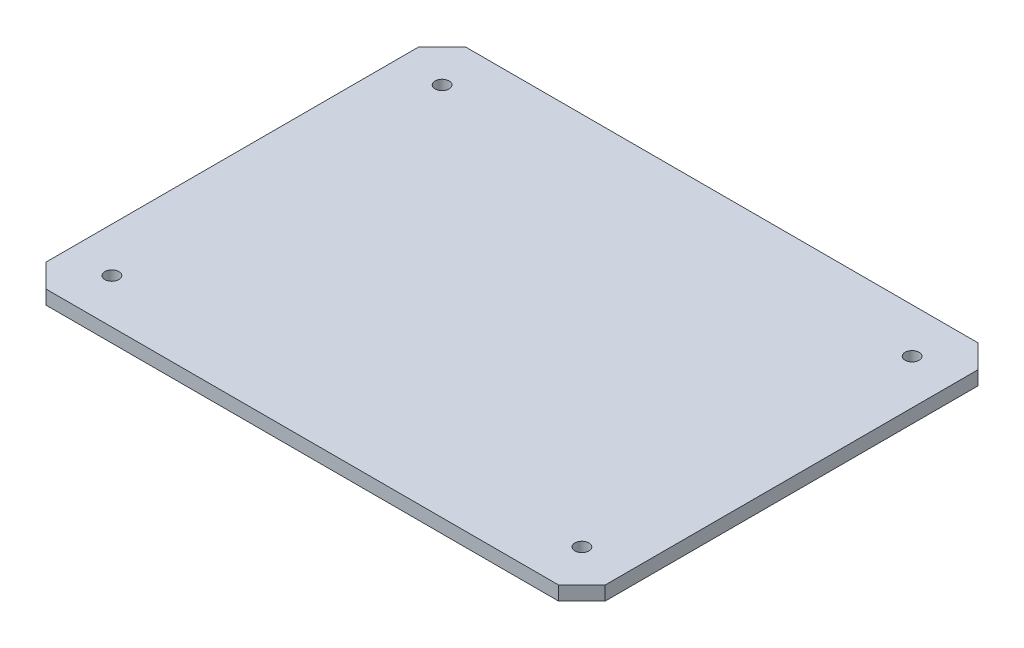
ISO-10303-21;
HEADER;
FILE_DESCRIPTION(('STEP AP214'),'2;1');
FILE_NAME('part.step','',(''),(''),'','','');
FILE_SCHEMA(('AUTOMOTIVE_DESIGN { 1 0 10303 214 1 1 1 1 }'));
ENDSEC;
DATA;
#1=APPLICATION_CONTEXT('core data for automotive mechanical design processes');
#2=APPLICATION_PROTOCOL_DEFINITION('international standard','automotive_design',2000,#1);
#3=PRODUCT_CONTEXT('',#1,'mechanical');
#4=PRODUCT('Part','Part','',(#3));
#5=PRODUCT_RELATED_PRODUCT_CATEGORY('part','',(#4));
#6=PRODUCT_DEFINITION_FORMATION('','',#4);
#7=PRODUCT_DEFINITION_CONTEXT('part definition',#1,'design');
#8=PRODUCT_DEFINITION('design','',#6,#7);
#9=PRODUCT_DEFINITION_SHAPE('','',#8);
#10=(LENGTH_UNIT() NAMED_UNIT(*) SI_UNIT(.MILLI.,.METRE.));
#11=(NAMED_UNIT(*) PLANE_ANGLE_UNIT() SI_UNIT($,.RADIAN.));
#12=(NAMED_UNIT(*) SI_UNIT($,.STERADIAN.) SOLID_ANGLE_UNIT());
#13=UNCERTAINTY_MEASURE_WITH_UNIT(LENGTH_MEASURE(1.E-05),#10,'distance_accuracy_value','');
#14=(GEOMETRIC_REPRESENTATION_CONTEXT(3) GLOBAL_UNCERTAINTY_ASSIGNED_CONTEXT((#13)) GLOBAL_UNIT_ASSIGNED_CONTEXT((#10,
#11,#12)) REPRESENTATION_CONTEXT('',''));
#15=CARTESIAN_POINT('',(0.,0.,0.));
#16=DIRECTION('',(0.,0.,1.));
#17=DIRECTION('',(1.,0.,0.));
#18=AXIS2_PLACEMENT_3D('',#15,#16,#17);
#19=CARTESIAN_POINT('',(0.,3.,0.));
#20=DIRECTION('',(0.,1.,0.));
#21=DIRECTION('',(0.,0.,1.));
#22=AXIS2_PLACEMENT_3D('',#19,#20,#21);
#23=PLANE('',#22);
#24=CARTESIAN_POINT('',(50.4289321881345,3.,35.4289321881345));
#25=DIRECTION('',(0.,-1.,0.));
#26=DIRECTION('',(0.,0.,-1.));
#27=AXIS2_PLACEMENT_3D('',#24,#25,#26);
#28=CIRCLE('',#27,1.49999999999999);
#29=CARTESIAN_POINT('',(50.4289321881345,3.,33.9289321881345));
#30=VERTEX_POINT('',#29);
#31=EDGE_CURVE('E186',#30,#30,#28,.T.);
#32=ORIENTED_EDGE('',*,*,#31,.T.);
#33=EDGE_LOOP('',(#32));
#34=FACE_BOUND('',#33,.T.);
#35=DIRECTION('',(0.,0.,1.));
#36=VECTOR('',#35,1.);
#37=CARTESIAN_POINT('',(-60.,3.,-45.));
#38=LINE('',#37,#36);
#39=CARTESIAN_POINT('',(-60.,3.,-40.));
#40=VERTEX_POINT('',#39);
#41=CARTESIAN_POINT('',(-60.,3.,39.9999999999999));
#42=VERTEX_POINT('',#41);
#43=EDGE_CURVE('E180',#40,#42,#38,.T.);
#44=ORIENTED_EDGE('',*,*,#43,.T.);
#45=DIRECTION('',(-0.707106781186546,0.,-0.707106781186549));
#46=VECTOR('',#45,1.);
#47=CARTESIAN_POINT('',(-50.0000000000002,3.,49.9999999999999));
#48=LINE('',#47,#46);
#49=CARTESIAN_POINT('',(-55.,3.,45.));
#50=VERTEX_POINT('',#49);
#51=EDGE_CURVE('E157',#42,#50,#48,.F.);
#52=ORIENTED_EDGE('',*,*,#51,.T.);
#53=DIRECTION('',(1.,0.,0.));
#54=VECTOR('',#53,1.);
#55=CARTESIAN_POINT('',(-60.,3.,45.));
#56=LINE('',#55,#54);
#57=CARTESIAN_POINT('',(55.,3.,45.));
#58=VERTEX_POINT('',#57);
#59=EDGE_CURVE('E128',#50,#58,#56,.T.);
#60=ORIENTED_EDGE('',*,*,#59,.T.);
#61=DIRECTION('',(-0.70710678118655,0.,0.707106781186546));
#62=VECTOR('',#61,1.);
#63=CARTESIAN_POINT('',(49.9999999999998,3.,50.0000000000001));
#64=LINE('',#63,#62);
#65=CARTESIAN_POINT('',(60.,3.,40.));
#66=VERTEX_POINT('',#65);
#67=EDGE_CURVE('E152',#58,#66,#64,.F.);
#68=ORIENTED_EDGE('',*,*,#67,.T.);
#69=DIRECTION('',(0.,0.,-1.));
#70=VECTOR('',#69,1.);
#71=CARTESIAN_POINT('',(60.,3.,-45.));
#72=LINE('',#71,#70);
#73=CARTESIAN_POINT('',(60.,3.,-40.));
#74=VERTEX_POINT('',#73);
#75=EDGE_CURVE('E135',#66,#74,#72,.T.);
#76=ORIENTED_EDGE('',*,*,#75,.T.);
#77=DIRECTION('',(0.707106781186546,0.,0.707106781186549));
#78=VECTOR('',#77,1.);
#79=CARTESIAN_POINT('',(50.0000000000001,3.,-49.9999999999999));
#80=LINE('',#79,#78);
#81=CARTESIAN_POINT('',(55.,3.,-45.));
#82=VERTEX_POINT('',#81);
#83=EDGE_CURVE('E64',#74,#82,#80,.F.);
#84=ORIENTED_EDGE('',*,*,#83,.T.);
#85=DIRECTION('',(-1.,0.,0.));
#86=VECTOR('',#85,1.);
#87=CARTESIAN_POINT('',(-60.,3.,-45.));
#88=LINE('',#87,#86);
#89=CARTESIAN_POINT('',(-55.,3.,-45.));
#90=VERTEX_POINT('',#89);
#91=EDGE_CURVE('E138',#82,#90,#88,.T.);
#92=ORIENTED_EDGE('',*,*,#91,.T.);
#93=DIRECTION('',(0.70710678118655,0.,-0.707106781186546));
#94=VECTOR('',#93,1.);
#95=CARTESIAN_POINT('',(-49.9999999999998,3.,-50.0000000000001));
#96=LINE('',#95,#94);
#97=EDGE_CURVE('E155',#90,#40,#96,.F.);
#98=ORIENTED_EDGE('',*,*,#97,.T.);
#99=EDGE_LOOP('',(#44,#52,#60,#68,#76,#84,#92,#98));
#100=FACE_BOUND('',#99,.T.);
#101=CARTESIAN_POINT('',(-50.4289321881345,3.,35.4289321881345));
#102=DIRECTION('',(0.,-1.,0.));
#103=DIRECTION('',(0.,0.,-1.));
#104=AXIS2_PLACEMENT_3D('',#101,#102,#103);
#105=CIRCLE('',#104,1.49999999999999);
#106=CARTESIAN_POINT('',(-50.4289321881345,3.,33.9289321881345));
#107=VERTEX_POINT('',#106);
#108=EDGE_CURVE('E173',#107,#107,#105,.T.);
#109=ORIENTED_EDGE('',*,*,#108,.T.);
#110=EDGE_LOOP('',(#109));
#111=FACE_BOUND('',#110,.T.);
#112=CARTESIAN_POINT('',(-50.4289321881345,3.,-35.4289321881345));
#113=DIRECTION('',(0.,-1.,0.));
#114=DIRECTION('',(0.,0.,-1.));
#115=AXIS2_PLACEMENT_3D('',#112,#113,#114);
#116=CIRCLE('',#115,1.49999999999999);
#117=CARTESIAN_POINT('',(-50.4289321881345,3.,-36.9289321881345));
#118=VERTEX_POINT('',#117);
#119=EDGE_CURVE('E192',#118,#118,#116,.T.);
#120=ORIENTED_EDGE('',*,*,#119,.T.);
#121=EDGE_LOOP('',(#120));
#122=FACE_BOUND('',#121,.T.);
#123=CARTESIAN_POINT('',(50.4289321881345,3.,-35.4289321881345));
#124=DIRECTION('',(0.,-1.,0.));
#125=DIRECTION('',(0.,0.,-1.));
#126=AXIS2_PLACEMENT_3D('',#123,#124,#125);
#127=CIRCLE('',#126,1.49999999999999);
#128=CARTESIAN_POINT('',(50.4289321881345,3.,-36.9289321881345));
#129=VERTEX_POINT('',#128);
#130=EDGE_CURVE('E198',#129,#129,#127,.T.);
#131=ORIENTED_EDGE('',*,*,#130,.T.);
#132=EDGE_LOOP('',(#131));
#133=FACE_BOUND('',#132,.T.);
#134=ADVANCED_FACE('F41',(#34,#100,#111,#122,#133),#23,.T.);
#135=CARTESIAN_POINT('',(0.,0.,0.));
#136=DIRECTION('',(0.,1.,0.));
#137=DIRECTION('',(0.,0.,1.));
#138=AXIS2_PLACEMENT_3D('',#135,#136,#137);
#139=PLANE('',#138);
#140=CARTESIAN_POINT('',(-50.4289321881345,0.,-35.4289321881345));
#141=DIRECTION('',(0.,-1.,0.));
#142=DIRECTION('',(0.,0.,-1.));
#143=AXIS2_PLACEMENT_3D('',#140,#141,#142);
#144=CIRCLE('',#143,1.49999999999999);
#145=CARTESIAN_POINT('',(-50.4289321881345,0.,-36.9289321881345));
#146=VERTEX_POINT('',#145);
#147=EDGE_CURVE('E195',#146,#146,#144,.T.);
#148=ORIENTED_EDGE('',*,*,#147,.F.);
#149=EDGE_LOOP('',(#148));
#150=FACE_BOUND('',#149,.T.);
#151=CARTESIAN_POINT('',(50.4289321881345,0.,35.4289321881345));
#152=DIRECTION('',(0.,-1.,0.));
#153=DIRECTION('',(0.,0.,-1.));
#154=AXIS2_PLACEMENT_3D('',#151,#152,#153);
#155=CIRCLE('',#154,1.49999999999999);
#156=CARTESIAN_POINT('',(50.4289321881345,0.,33.9289321881345));
#157=VERTEX_POINT('',#156);
#158=EDGE_CURVE('E189',#157,#157,#155,.T.);
#159=ORIENTED_EDGE('',*,*,#158,.F.);
#160=EDGE_LOOP('',(#159));
#161=FACE_BOUND('',#160,.T.);
#162=CARTESIAN_POINT('',(-50.4289321881345,0.,35.4289321881345));
#163=DIRECTION('',(0.,-1.,0.));
#164=DIRECTION('',(0.,0.,-1.));
#165=AXIS2_PLACEMENT_3D('',#162,#163,#164);
#166=CIRCLE('',#165,1.49999999999999);
#167=CARTESIAN_POINT('',(-50.4289321881345,0.,33.9289321881345));
#168=VERTEX_POINT('',#167);
#169=EDGE_CURVE('E176',#168,#168,#166,.T.);
#170=ORIENTED_EDGE('',*,*,#169,.F.);
#171=EDGE_LOOP('',(#170));
#172=FACE_BOUND('',#171,.T.);
#173=DIRECTION('',(1.,0.,0.));
#174=VECTOR('',#173,1.);
#175=CARTESIAN_POINT('',(-60.,0.,45.));
#176=LINE('',#175,#174);
#177=CARTESIAN_POINT('',(-55.,0.,45.));
#178=VERTEX_POINT('',#177);
#179=CARTESIAN_POINT('',(55.,0.,45.));
#180=VERTEX_POINT('',#179);
#181=EDGE_CURVE('E125',#178,#180,#176,.T.);
#182=ORIENTED_EDGE('',*,*,#181,.F.);
#183=DIRECTION('',(0.707106781186546,0.,0.707106781186549));
#184=VECTOR('',#183,1.);
#185=CARTESIAN_POINT('',(-55.,0.,45.));
#186=LINE('',#185,#184);
#187=CARTESIAN_POINT('',(-60.,0.,39.9999999999999));
#188=VERTEX_POINT('',#187);
#189=EDGE_CURVE('E108',#178,#188,#186,.F.);
#190=ORIENTED_EDGE('',*,*,#189,.T.);
#191=DIRECTION('',(0.,0.,1.));
#192=VECTOR('',#191,1.);
#193=CARTESIAN_POINT('',(-60.,0.,-45.));
#194=LINE('',#193,#192);
#195=CARTESIAN_POINT('',(-60.,0.,-40.));
#196=VERTEX_POINT('',#195);
#197=EDGE_CURVE('E136',#196,#188,#194,.T.);
#198=ORIENTED_EDGE('',*,*,#197,.F.);
#199=DIRECTION('',(-0.70710678118655,0.,0.707106781186546));
#200=VECTOR('',#199,1.);
#201=CARTESIAN_POINT('',(-60.,0.,-40.));
#202=LINE('',#201,#200);
#203=CARTESIAN_POINT('',(-55.,0.,-45.));
#204=VERTEX_POINT('',#203);
#205=EDGE_CURVE('E119',#196,#204,#202,.F.);
#206=ORIENTED_EDGE('',*,*,#205,.T.);
#207=DIRECTION('',(-1.,0.,0.));
#208=VECTOR('',#207,1.);
#209=CARTESIAN_POINT('',(-60.,0.,-45.));
#210=LINE('',#209,#208);
#211=CARTESIAN_POINT('',(55.,0.,-45.));
#212=VERTEX_POINT('',#211);
#213=EDGE_CURVE('E140',#212,#204,#210,.T.);
#214=ORIENTED_EDGE('',*,*,#213,.F.);
#215=DIRECTION('',(-0.707106781186546,0.,-0.707106781186549));
#216=VECTOR('',#215,1.);
#217=CARTESIAN_POINT('',(55.,0.,-45.));
#218=LINE('',#217,#216);
#219=CARTESIAN_POINT('',(60.,0.,-40.));
#220=VERTEX_POINT('',#219);
#221=EDGE_CURVE('E146',#212,#220,#218,.F.);
#222=ORIENTED_EDGE('',*,*,#221,.T.);
#223=DIRECTION('',(0.,0.,-1.));
#224=VECTOR('',#223,1.);
#225=CARTESIAN_POINT('',(60.,0.,-45.));
#226=LINE('',#225,#224);
#227=CARTESIAN_POINT('',(60.,0.,40.));
#228=VERTEX_POINT('',#227);
#229=EDGE_CURVE('E168',#228,#220,#226,.T.);
#230=ORIENTED_EDGE('',*,*,#229,.F.);
#231=DIRECTION('',(0.70710678118655,0.,-0.707106781186546));
#232=VECTOR('',#231,1.);
#233=CARTESIAN_POINT('',(60.,0.,40.));
#234=LINE('',#233,#232);
#235=EDGE_CURVE('E129',#228,#180,#234,.F.);
#236=ORIENTED_EDGE('',*,*,#235,.T.);
#237=EDGE_LOOP('',(#182,#190,#198,#206,#214,#222,#230,#236));
#238=FACE_BOUND('',#237,.T.);
#239=CARTESIAN_POINT('',(50.4289321881345,0.,-35.4289321881345));
#240=DIRECTION('',(0.,-1.,0.));
#241=DIRECTION('',(0.,0.,-1.));
#242=AXIS2_PLACEMENT_3D('',#239,#240,#241);
#243=CIRCLE('',#242,1.49999999999999);
#244=CARTESIAN_POINT('',(50.4289321881345,0.,-36.9289321881345));
#245=VERTEX_POINT('',#244);
#246=EDGE_CURVE('E201',#245,#245,#243,.T.);
#247=ORIENTED_EDGE('',*,*,#246,.F.);
#248=EDGE_LOOP('',(#247));
#249=FACE_BOUND('',#248,.T.);
#250=ADVANCED_FACE('F132',(#150,#161,#172,#238,#249),#139,.F.);
#251=CARTESIAN_POINT('',(60.,3.,-45.));
#252=DIRECTION('',(-1.,0.,0.));
#253=DIRECTION('',(0.,0.,1.));
#254=AXIS2_PLACEMENT_3D('',#251,#252,#253);
#255=PLANE('',#254);
#256=ORIENTED_EDGE('',*,*,#229,.T.);
#257=DIRECTION('',(0.,1.,0.));
#258=VECTOR('',#257,1.);
#259=CARTESIAN_POINT('',(60.,3.,-40.));
#260=LINE('',#259,#258);
#261=EDGE_CURVE('E11',#220,#74,#260,.T.);
#262=ORIENTED_EDGE('',*,*,#261,.T.);
#263=ORIENTED_EDGE('',*,*,#75,.F.);
#264=DIRECTION('',(0.,-1.,0.));
#265=VECTOR('',#264,1.);
#266=CARTESIAN_POINT('',(60.,3.,40.));
#267=LINE('',#266,#265);
#268=EDGE_CURVE('E50',#66,#228,#267,.T.);
#269=ORIENTED_EDGE('',*,*,#268,.T.);
#270=EDGE_LOOP('',(#256,#262,#263,#269));
#271=FACE_BOUND('',#270,.T.);
#272=ADVANCED_FACE('F167',(#271),#255,.F.);
#273=CARTESIAN_POINT('',(-60.,3.,-45.));
#274=DIRECTION('',(0.,0.,1.));
#275=DIRECTION('',(1.,0.,0.));
#276=AXIS2_PLACEMENT_3D('',#273,#274,#275);
#277=PLANE('',#276);
#278=ORIENTED_EDGE('',*,*,#213,.T.);
#279=DIRECTION('',(0.,1.,0.));
#280=VECTOR('',#279,1.);
#281=CARTESIAN_POINT('',(-55.,3.,-45.));
#282=LINE('',#281,#280);
#283=EDGE_CURVE('E57',#204,#90,#282,.T.);
#284=ORIENTED_EDGE('',*,*,#283,.T.);
#285=ORIENTED_EDGE('',*,*,#91,.F.);
#286=DIRECTION('',(0.,-1.,0.));
#287=VECTOR('',#286,1.);
#288=CARTESIAN_POINT('',(55.,3.,-45.));
#289=LINE('',#288,#287);
#290=EDGE_CURVE('E159',#82,#212,#289,.T.);
#291=ORIENTED_EDGE('',*,*,#290,.T.);
#292=EDGE_LOOP('',(#278,#284,#285,#291));
#293=FACE_BOUND('',#292,.T.);
#294=ADVANCED_FACE('F213',(#293),#277,.F.);
#295=CARTESIAN_POINT('',(-60.,3.,-45.));
#296=DIRECTION('',(1.,0.,0.));
#297=DIRECTION('',(0.,0.,-1.));
#298=AXIS2_PLACEMENT_3D('',#295,#296,#297);
#299=PLANE('',#298);
#300=ORIENTED_EDGE('',*,*,#197,.T.);
#301=DIRECTION('',(0.,1.,0.));
#302=VECTOR('',#301,1.);
#303=CARTESIAN_POINT('',(-60.,3.,40.));
#304=LINE('',#303,#302);
#305=EDGE_CURVE('E113',#188,#42,#304,.T.);
#306=ORIENTED_EDGE('',*,*,#305,.T.);
#307=ORIENTED_EDGE('',*,*,#43,.F.);
#308=DIRECTION('',(0.,-1.,0.));
#309=VECTOR('',#308,1.);
#310=CARTESIAN_POINT('',(-60.,3.,-40.));
#311=LINE('',#310,#309);
#312=EDGE_CURVE('E118',#40,#196,#311,.T.);
#313=ORIENTED_EDGE('',*,*,#312,.T.);
#314=EDGE_LOOP('',(#300,#306,#307,#313));
#315=FACE_BOUND('',#314,.T.);
#316=ADVANCED_FACE('F223',(#315),#299,.F.);
#317=CARTESIAN_POINT('',(-60.,3.,45.));
#318=DIRECTION('',(0.,0.,-1.));
#319=DIRECTION('',(-1.,0.,0.));
#320=AXIS2_PLACEMENT_3D('',#317,#318,#319);
#321=PLANE('',#320);
#322=ORIENTED_EDGE('',*,*,#59,.F.);
#323=DIRECTION('',(0.,-1.,0.));
#324=VECTOR('',#323,1.);
#325=CARTESIAN_POINT('',(-55.,3.,45.));
#326=LINE('',#325,#324);
#327=EDGE_CURVE('E112',#50,#178,#326,.T.);
#328=ORIENTED_EDGE('',*,*,#327,.T.);
#329=ORIENTED_EDGE('',*,*,#181,.T.);
#330=DIRECTION('',(0.,1.,0.));
#331=VECTOR('',#330,1.);
#332=CARTESIAN_POINT('',(55.,3.,45.));
#333=LINE('',#332,#331);
#334=EDGE_CURVE('E130',#180,#58,#333,.T.);
#335=ORIENTED_EDGE('',*,*,#334,.T.);
#336=EDGE_LOOP('',(#322,#328,#329,#335));
#337=FACE_BOUND('',#336,.T.);
#338=ADVANCED_FACE('F124',(#337),#321,.F.);
#339=CARTESIAN_POINT('',(-55.,3.,45.));
#340=DIRECTION('',(0.707106781186549,0.,-0.707106781186545));
#341=DIRECTION('',(0.,-1.,0.));
#342=AXIS2_PLACEMENT_3D('',#339,#340,#341);
#343=PLANE('',#342);
#344=ORIENTED_EDGE('',*,*,#51,.F.);
#345=ORIENTED_EDGE('',*,*,#305,.F.);
#346=ORIENTED_EDGE('',*,*,#189,.F.);
#347=ORIENTED_EDGE('',*,*,#327,.F.);
#348=EDGE_LOOP('',(#344,#345,#346,#347));
#349=FACE_BOUND('',#348,.T.);
#350=ADVANCED_FACE('F111',(#349),#343,.F.);
#351=CARTESIAN_POINT('',(-60.,3.,-40.));
#352=DIRECTION('',(0.707106781186545,0.,0.707106781186549));
#353=DIRECTION('',(0.,-1.,0.));
#354=AXIS2_PLACEMENT_3D('',#351,#352,#353);
#355=PLANE('',#354);
#356=ORIENTED_EDGE('',*,*,#97,.F.);
#357=ORIENTED_EDGE('',*,*,#283,.F.);
#358=ORIENTED_EDGE('',*,*,#205,.F.);
#359=ORIENTED_EDGE('',*,*,#312,.F.);
#360=EDGE_LOOP('',(#356,#357,#358,#359));
#361=FACE_BOUND('',#360,.T.);
#362=ADVANCED_FACE('F235',(#361),#355,.F.);
#363=CARTESIAN_POINT('',(55.,3.,-45.));
#364=DIRECTION('',(-0.707106781186549,0.,0.707106781186545));
#365=DIRECTION('',(0.,-1.,0.));
#366=AXIS2_PLACEMENT_3D('',#363,#364,#365);
#367=PLANE('',#366);
#368=ORIENTED_EDGE('',*,*,#83,.F.);
#369=ORIENTED_EDGE('',*,*,#261,.F.);
#370=ORIENTED_EDGE('',*,*,#221,.F.);
#371=ORIENTED_EDGE('',*,*,#290,.F.);
#372=EDGE_LOOP('',(#368,#369,#370,#371));
#373=FACE_BOUND('',#372,.T.);
#374=ADVANCED_FACE('F240',(#373),#367,.F.);
#375=CARTESIAN_POINT('',(60.,3.,40.));
#376=DIRECTION('',(-0.707106781186545,0.,-0.707106781186549));
#377=DIRECTION('',(0.,-1.,0.));
#378=AXIS2_PLACEMENT_3D('',#375,#376,#377);
#379=PLANE('',#378);
#380=ORIENTED_EDGE('',*,*,#67,.F.);
#381=ORIENTED_EDGE('',*,*,#334,.F.);
#382=ORIENTED_EDGE('',*,*,#235,.F.);
#383=ORIENTED_EDGE('',*,*,#268,.F.);
#384=EDGE_LOOP('',(#380,#381,#382,#383));
#385=FACE_BOUND('',#384,.T.);
#386=ADVANCED_FACE('F44',(#385),#379,.F.);
#387=CARTESIAN_POINT('',(-50.4289321881345,0.,35.4289321881345));
#388=DIRECTION('',(0.,-1.,0.));
#389=DIRECTION('',(0.,0.,-1.));
#390=AXIS2_PLACEMENT_3D('',#387,#388,#389);
#391=CYLINDRICAL_SURFACE('',#390,1.49999999999999);
#392=ORIENTED_EDGE('',*,*,#108,.F.);
#393=EDGE_LOOP('',(#392));
#394=FACE_BOUND('',#393,.T.);
#395=ORIENTED_EDGE('',*,*,#169,.T.);
#396=EDGE_LOOP('',(#395));
#397=FACE_BOUND('',#396,.T.);
#398=ADVANCED_FACE('F249',(#394,#397),#391,.F.);
#399=CARTESIAN_POINT('',(50.4289321881345,0.,35.4289321881345));
#400=DIRECTION('',(0.,-1.,0.));
#401=DIRECTION('',(0.,0.,-1.));
#402=AXIS2_PLACEMENT_3D('',#399,#400,#401);
#403=CYLINDRICAL_SURFACE('',#402,1.49999999999999);
#404=ORIENTED_EDGE('',*,*,#31,.F.);
#405=EDGE_LOOP('',(#404));
#406=FACE_BOUND('',#405,.T.);
#407=ORIENTED_EDGE('',*,*,#158,.T.);
#408=EDGE_LOOP('',(#407));
#409=FACE_BOUND('',#408,.T.);
#410=ADVANCED_FACE('F267',(#406,#409),#403,.F.);
#411=CARTESIAN_POINT('',(-50.4289321881345,0.,-35.4289321881345));
#412=DIRECTION('',(0.,-1.,0.));
#413=DIRECTION('',(0.,0.,-1.));
#414=AXIS2_PLACEMENT_3D('',#411,#412,#413);
#415=CYLINDRICAL_SURFACE('',#414,1.49999999999999);
#416=ORIENTED_EDGE('',*,*,#119,.F.);
#417=EDGE_LOOP('',(#416));
#418=FACE_BOUND('',#417,.T.);
#419=ORIENTED_EDGE('',*,*,#147,.T.);
#420=EDGE_LOOP('',(#419));
#421=FACE_BOUND('',#420,.T.);
#422=ADVANCED_FACE('F262',(#418,#421),#415,.F.);
#423=CARTESIAN_POINT('',(50.4289321881345,0.,-35.4289321881345));
#424=DIRECTION('',(0.,-1.,0.));
#425=DIRECTION('',(0.,0.,-1.));
#426=AXIS2_PLACEMENT_3D('',#423,#424,#425);
#427=CYLINDRICAL_SURFACE('',#426,1.49999999999999);
#428=ORIENTED_EDGE('',*,*,#130,.F.);
#429=EDGE_LOOP('',(#428));
#430=FACE_BOUND('',#429,.T.);
#431=ORIENTED_EDGE('',*,*,#246,.T.);
#432=EDGE_LOOP('',(#431));
#433=FACE_BOUND('',#432,.T.);
#434=ADVANCED_FACE('F205',(#430,#433),#427,.F.);
#435=CLOSED_SHELL('',(#134,#250,#272,#294,#316,#338,#350,#362,#374,#386,#398,#410,#422,#434));
#436=MANIFOLD_SOLID_BREP('B2',#435);
#437=ADVANCED_BREP_SHAPE_REPRESENTATION('',(#18,#436),#14);
#438=SHAPE_DEFINITION_REPRESENTATION(#9,#437);
ENDSEC;
END-ISO-10303-21;
